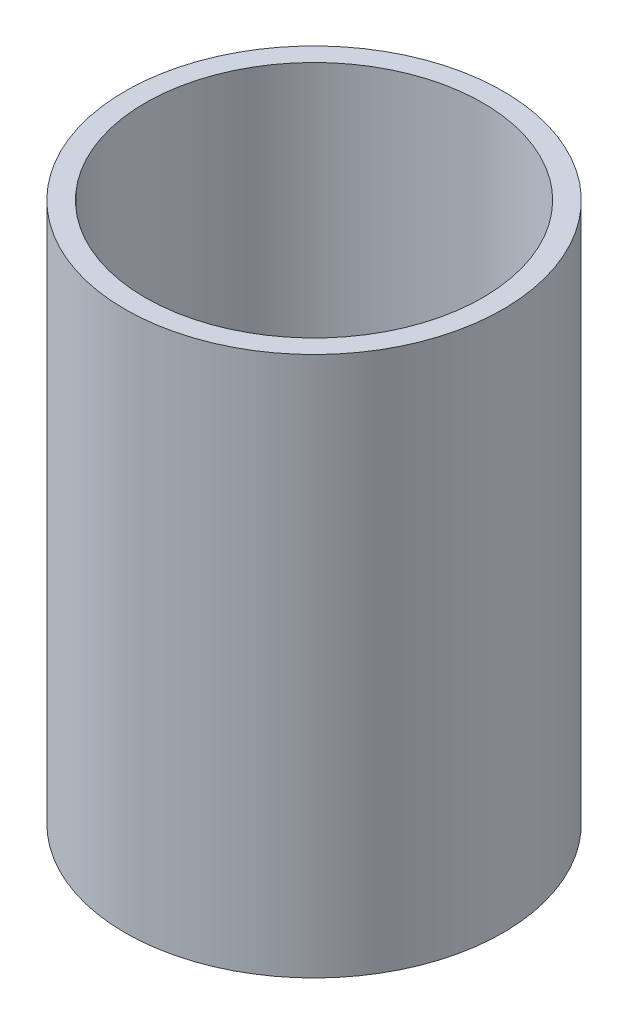
ISO-10303-21;
HEADER;
FILE_DESCRIPTION(('STEP AP214'),'2;1');
FILE_NAME('part.step','',(''),(''),'','','');
FILE_SCHEMA(('AUTOMOTIVE_DESIGN { 1 0 10303 214 1 1 1 1 }'));
ENDSEC;
DATA;
#1=APPLICATION_CONTEXT('core data for automotive mechanical design processes');
#2=APPLICATION_PROTOCOL_DEFINITION('international standard','automotive_design',2000,#1);
#3=PRODUCT_CONTEXT('',#1,'mechanical');
#4=PRODUCT('Part','Part','',(#3));
#5=PRODUCT_RELATED_PRODUCT_CATEGORY('part','',(#4));
#6=PRODUCT_DEFINITION_FORMATION('','',#4);
#7=PRODUCT_DEFINITION_CONTEXT('part definition',#1,'design');
#8=PRODUCT_DEFINITION('design','',#6,#7);
#9=PRODUCT_DEFINITION_SHAPE('','',#8);
#10=(LENGTH_UNIT() NAMED_UNIT(*) SI_UNIT(.MILLI.,.METRE.));
#11=(NAMED_UNIT(*) PLANE_ANGLE_UNIT() SI_UNIT($,.RADIAN.));
#12=(NAMED_UNIT(*) SI_UNIT($,.STERADIAN.) SOLID_ANGLE_UNIT());
#13=UNCERTAINTY_MEASURE_WITH_UNIT(LENGTH_MEASURE(1.E-05),#10,'distance_accuracy_value','');
#14=(GEOMETRIC_REPRESENTATION_CONTEXT(3) GLOBAL_UNCERTAINTY_ASSIGNED_CONTEXT((#13)) GLOBAL_UNIT_ASSIGNED_CONTEXT((#10,
#11,#12)) REPRESENTATION_CONTEXT('',''));
#15=CARTESIAN_POINT('',(0.,0.,0.));
#16=DIRECTION('',(0.,0.,1.));
#17=DIRECTION('',(1.,0.,0.));
#18=AXIS2_PLACEMENT_3D('',#15,#16,#17);
#19=CARTESIAN_POINT('',(0.,400.,0.));
#20=DIRECTION('',(0.,1.,0.));
#21=DIRECTION('',(0.,0.,1.));
#22=AXIS2_PLACEMENT_3D('',#19,#20,#21);
#23=PLANE('',#22);
#24=CARTESIAN_POINT('',(0.,400.,0.));
#25=DIRECTION('',(0.,1.,0.));
#26=DIRECTION('',(0.,0.,1.));
#27=AXIS2_PLACEMENT_3D('',#24,#25,#26);
#28=CIRCLE('',#27,140.);
#29=CARTESIAN_POINT('',(0.,400.,140.));
#30=VERTEX_POINT('',#29);
#31=EDGE_CURVE('E10',#30,#30,#28,.T.);
#32=ORIENTED_EDGE('',*,*,#31,.T.);
#33=EDGE_LOOP('',(#32));
#34=FACE_BOUND('',#33,.T.);
#35=CARTESIAN_POINT('',(0.,400.,0.));
#36=DIRECTION('',(0.,1.,0.));
#37=DIRECTION('',(0.,0.,1.));
#38=AXIS2_PLACEMENT_3D('',#35,#36,#37);
#39=CIRCLE('',#38,125.);
#40=CARTESIAN_POINT('',(0.,400.,125.));
#41=VERTEX_POINT('',#40);
#42=EDGE_CURVE('E49',#41,#41,#39,.T.);
#43=ORIENTED_EDGE('',*,*,#42,.F.);
#44=EDGE_LOOP('',(#43));
#45=FACE_BOUND('',#44,.T.);
#46=ADVANCED_FACE('F36',(#34,#45),#23,.T.);
#47=CARTESIAN_POINT('',(0.,0.,0.));
#48=DIRECTION('',(0.,1.,0.));
#49=DIRECTION('',(0.,0.,1.));
#50=AXIS2_PLACEMENT_3D('',#47,#48,#49);
#51=PLANE('',#50);
#52=CARTESIAN_POINT('',(0.,0.,0.));
#53=DIRECTION('',(0.,1.,0.));
#54=DIRECTION('',(0.,0.,1.));
#55=AXIS2_PLACEMENT_3D('',#52,#53,#54);
#56=CIRCLE('',#55,140.);
#57=CARTESIAN_POINT('',(0.,0.,140.));
#58=VERTEX_POINT('',#57);
#59=EDGE_CURVE('E40',#58,#58,#56,.T.);
#60=ORIENTED_EDGE('',*,*,#59,.F.);
#61=EDGE_LOOP('',(#60));
#62=FACE_BOUND('',#61,.T.);
#63=CARTESIAN_POINT('',(0.,0.,0.));
#64=DIRECTION('',(0.,1.,0.));
#65=DIRECTION('',(0.,0.,1.));
#66=AXIS2_PLACEMENT_3D('',#63,#64,#65);
#67=CIRCLE('',#66,125.);
#68=CARTESIAN_POINT('',(0.,0.,125.));
#69=VERTEX_POINT('',#68);
#70=EDGE_CURVE('E51',#69,#69,#67,.T.);
#71=ORIENTED_EDGE('',*,*,#70,.T.);
#72=EDGE_LOOP('',(#71));
#73=FACE_BOUND('',#72,.T.);
#74=ADVANCED_FACE('F63',(#62,#73),#51,.F.);
#75=CARTESIAN_POINT('',(0.,400.,0.));
#76=DIRECTION('',(0.,-1.,0.));
#77=DIRECTION('',(0.,0.,-1.));
#78=AXIS2_PLACEMENT_3D('',#75,#76,#77);
#79=CYLINDRICAL_SURFACE('',#78,140.);
#80=ORIENTED_EDGE('',*,*,#31,.F.);
#81=EDGE_LOOP('',(#80));
#82=FACE_BOUND('',#81,.T.);
#83=ORIENTED_EDGE('',*,*,#59,.T.);
#84=EDGE_LOOP('',(#83));
#85=FACE_BOUND('',#84,.T.);
#86=ADVANCED_FACE('F38',(#82,#85),#79,.T.);
#87=CARTESIAN_POINT('',(0.,400.,0.));
#88=DIRECTION('',(0.,-1.,0.));
#89=DIRECTION('',(0.,0.,-1.));
#90=AXIS2_PLACEMENT_3D('',#87,#88,#89);
#91=CYLINDRICAL_SURFACE('',#90,125.);
#92=ORIENTED_EDGE('',*,*,#42,.T.);
#93=EDGE_LOOP('',(#92));
#94=FACE_BOUND('',#93,.T.);
#95=ORIENTED_EDGE('',*,*,#70,.F.);
#96=EDGE_LOOP('',(#95));
#97=FACE_BOUND('',#96,.T.);
#98=ADVANCED_FACE('F59',(#94,#97),#91,.F.);
#99=CLOSED_SHELL('',(#46,#74,#86,#98));
#100=MANIFOLD_SOLID_BREP('B2',#99);
#101=ADVANCED_BREP_SHAPE_REPRESENTATION('',(#18,#100),#14);
#102=SHAPE_DEFINITION_REPRESENTATION(#9,#101);
ENDSEC;
END-ISO-10303-21;
